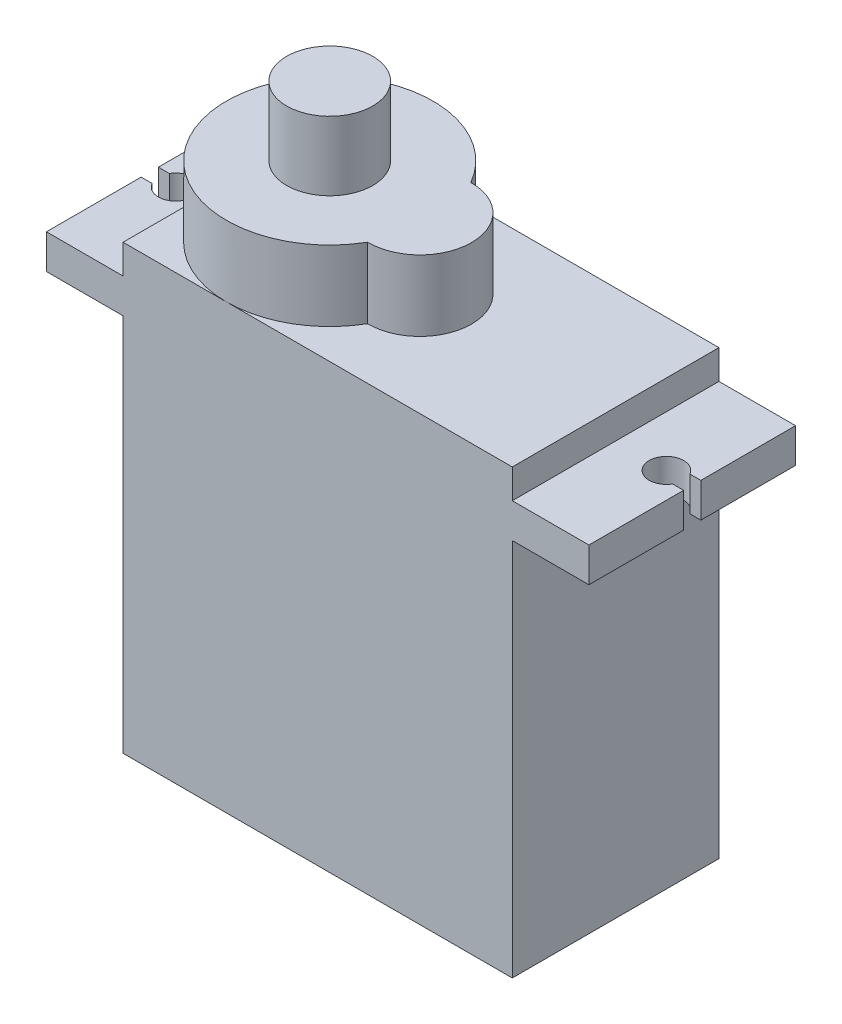
ISO-10303-21;
HEADER;
FILE_DESCRIPTION(('STEP AP214'),'2;1');
FILE_NAME('part.step','',(''),(''),'','','');
FILE_SCHEMA(('AUTOMOTIVE_DESIGN { 1 0 10303 214 1 1 1 1 }'));
ENDSEC;
DATA;
#1=APPLICATION_CONTEXT('core data for automotive mechanical design processes');
#2=APPLICATION_PROTOCOL_DEFINITION('international standard','automotive_design',2000,#1);
#3=PRODUCT_CONTEXT('',#1,'mechanical');
#4=PRODUCT('Part','Part','',(#3));
#5=PRODUCT_RELATED_PRODUCT_CATEGORY('part','',(#4));
#6=PRODUCT_DEFINITION_FORMATION('','',#4);
#7=PRODUCT_DEFINITION_CONTEXT('part definition',#1,'design');
#8=PRODUCT_DEFINITION('design','',#6,#7);
#9=PRODUCT_DEFINITION_SHAPE('','',#8);
#10=(LENGTH_UNIT() NAMED_UNIT(*) SI_UNIT(.MILLI.,.METRE.));
#11=(NAMED_UNIT(*) PLANE_ANGLE_UNIT() SI_UNIT($,.RADIAN.));
#12=(NAMED_UNIT(*) SI_UNIT($,.STERADIAN.) SOLID_ANGLE_UNIT());
#13=UNCERTAINTY_MEASURE_WITH_UNIT(LENGTH_MEASURE(1.E-05),#10,'distance_accuracy_value','');
#14=(GEOMETRIC_REPRESENTATION_CONTEXT(3) GLOBAL_UNCERTAINTY_ASSIGNED_CONTEXT((#13)) GLOBAL_UNIT_ASSIGNED_CONTEXT((#10,
#11,#12)) REPRESENTATION_CONTEXT('',''));
#15=CARTESIAN_POINT('',(0.,0.,0.));
#16=DIRECTION('',(0.,0.,1.));
#17=DIRECTION('',(1.,0.,0.));
#18=AXIS2_PLACEMENT_3D('',#15,#16,#17);
#19=CARTESIAN_POINT('',(0.,24.,0.));
#20=DIRECTION('',(0.,1.,0.));
#21=DIRECTION('',(0.,0.,1.));
#22=AXIS2_PLACEMENT_3D('',#19,#20,#21);
#23=PLANE('',#22);
#24=CARTESIAN_POINT('',(-2.95,24.,-6.));
#25=DIRECTION('',(0.,1.,0.));
#26=DIRECTION('',(0.,0.,1.));
#27=AXIS2_PLACEMENT_3D('',#24,#25,#26);
#28=CIRCLE('',#27,1.);
#29=CARTESIAN_POINT('',(-3.81602540378444,24.,-5.5));
#30=VERTEX_POINT('',#29);
#31=CARTESIAN_POINT('',(-3.81602540378444,24.,-6.5));
#32=VERTEX_POINT('',#31);
#33=EDGE_CURVE('E225',#30,#32,#28,.T.);
#34=ORIENTED_EDGE('',*,*,#33,.F.);
#35=DIRECTION('',(-1.,0.,0.));
#36=VECTOR('',#35,1.);
#37=CARTESIAN_POINT('',(0.,24.,-5.5));
#38=LINE('',#37,#36);
#39=CARTESIAN_POINT('',(-4.45,24.,-5.5));
#40=VERTEX_POINT('',#39);
#41=EDGE_CURVE('E204',#30,#40,#38,.T.);
#42=ORIENTED_EDGE('',*,*,#41,.T.);
#43=DIRECTION('',(0.,0.,1.));
#44=VECTOR('',#43,1.);
#45=CARTESIAN_POINT('',(-4.45,24.,-12.));
#46=LINE('',#45,#44);
#47=CARTESIAN_POINT('',(-4.45,24.,0.));
#48=VERTEX_POINT('',#47);
#49=EDGE_CURVE('E313',#40,#48,#46,.T.);
#50=ORIENTED_EDGE('',*,*,#49,.T.);
#51=DIRECTION('',(1.,0.,0.));
#52=VECTOR('',#51,1.);
#53=CARTESIAN_POINT('',(-4.45,24.,0.));
#54=LINE('',#53,#52);
#55=CARTESIAN_POINT('',(0.,24.,0.));
#56=VERTEX_POINT('',#55);
#57=EDGE_CURVE('E319',#48,#56,#54,.T.);
#58=ORIENTED_EDGE('',*,*,#57,.T.);
#59=DIRECTION('',(0.,0.,1.));
#60=VECTOR('',#59,1.);
#61=CARTESIAN_POINT('',(0.,24.,0.));
#62=LINE('',#61,#60);
#63=CARTESIAN_POINT('',(0.,24.,-12.));
#64=VERTEX_POINT('',#63);
#65=EDGE_CURVE('E278',#64,#56,#62,.T.);
#66=ORIENTED_EDGE('',*,*,#65,.F.);
#67=DIRECTION('',(-1.,0.,0.));
#68=VECTOR('',#67,1.);
#69=CARTESIAN_POINT('',(27.05,24.,-12.));
#70=LINE('',#69,#68);
#71=CARTESIAN_POINT('',(-4.45,24.,-12.));
#72=VERTEX_POINT('',#71);
#73=EDGE_CURVE('E314',#64,#72,#70,.T.);
#74=ORIENTED_EDGE('',*,*,#73,.T.);
#75=CARTESIAN_POINT('',(-4.45,24.,-6.5));
#76=VERTEX_POINT('',#75);
#77=EDGE_CURVE('E315',#72,#76,#46,.T.);
#78=ORIENTED_EDGE('',*,*,#77,.T.);
#79=DIRECTION('',(1.,0.,0.));
#80=VECTOR('',#79,1.);
#81=CARTESIAN_POINT('',(0.,24.,-6.5));
#82=LINE('',#81,#80);
#83=EDGE_CURVE('E55',#76,#32,#82,.T.);
#84=ORIENTED_EDGE('',*,*,#83,.T.);
#85=EDGE_LOOP('',(#34,#42,#50,#58,#66,#74,#78,#84));
#86=FACE_BOUND('',#85,.T.);
#87=ADVANCED_FACE('F38',(#86),#23,.T.);
#88=CARTESIAN_POINT('',(0.,22.,0.));
#89=DIRECTION('',(0.,1.,0.));
#90=DIRECTION('',(0.,0.,1.));
#91=AXIS2_PLACEMENT_3D('',#88,#89,#90);
#92=PLANE('',#91);
#93=DIRECTION('',(1.,0.,0.));
#94=VECTOR('',#93,1.);
#95=CARTESIAN_POINT('',(0.,22.,-5.5));
#96=LINE('',#95,#94);
#97=CARTESIAN_POINT('',(-4.45,22.,-5.5));
#98=VERTEX_POINT('',#97);
#99=CARTESIAN_POINT('',(-3.81602540378444,22.,-5.5));
#100=VERTEX_POINT('',#99);
#101=EDGE_CURVE('E201',#98,#100,#96,.T.);
#102=ORIENTED_EDGE('',*,*,#101,.T.);
#103=CARTESIAN_POINT('',(-2.95,22.,-6.));
#104=DIRECTION('',(0.,1.,0.));
#105=DIRECTION('',(0.,0.,1.));
#106=AXIS2_PLACEMENT_3D('',#103,#104,#105);
#107=CIRCLE('',#106,1.);
#108=CARTESIAN_POINT('',(-3.81602540378444,22.,-6.5));
#109=VERTEX_POINT('',#108);
#110=EDGE_CURVE('E211',#109,#100,#107,.F.);
#111=ORIENTED_EDGE('',*,*,#110,.F.);
#112=DIRECTION('',(-1.,0.,0.));
#113=VECTOR('',#112,1.);
#114=CARTESIAN_POINT('',(0.,22.,-6.5));
#115=LINE('',#114,#113);
#116=CARTESIAN_POINT('',(-4.45,22.,-6.5));
#117=VERTEX_POINT('',#116);
#118=EDGE_CURVE('E223',#109,#117,#115,.T.);
#119=ORIENTED_EDGE('',*,*,#118,.T.);
#120=DIRECTION('',(0.,0.,1.));
#121=VECTOR('',#120,1.);
#122=CARTESIAN_POINT('',(-4.45,22.,-12.));
#123=LINE('',#122,#121);
#124=CARTESIAN_POINT('',(-4.45,22.,-12.));
#125=VERTEX_POINT('',#124);
#126=EDGE_CURVE('E329',#125,#117,#123,.T.);
#127=ORIENTED_EDGE('',*,*,#126,.F.);
#128=DIRECTION('',(-1.,0.,0.));
#129=VECTOR('',#128,1.);
#130=CARTESIAN_POINT('',(27.05,22.,-12.));
#131=LINE('',#130,#129);
#132=CARTESIAN_POINT('',(0.,22.,-12.));
#133=VERTEX_POINT('',#132);
#134=EDGE_CURVE('E310',#133,#125,#131,.T.);
#135=ORIENTED_EDGE('',*,*,#134,.F.);
#136=DIRECTION('',(0.,0.,1.));
#137=VECTOR('',#136,1.);
#138=CARTESIAN_POINT('',(0.,22.,0.));
#139=LINE('',#138,#137);
#140=CARTESIAN_POINT('',(0.,22.,0.));
#141=VERTEX_POINT('',#140);
#142=EDGE_CURVE('E352',#133,#141,#139,.T.);
#143=ORIENTED_EDGE('',*,*,#142,.T.);
#144=DIRECTION('',(1.,0.,0.));
#145=VECTOR('',#144,1.);
#146=CARTESIAN_POINT('',(-4.45,22.,0.));
#147=LINE('',#146,#145);
#148=CARTESIAN_POINT('',(-4.45,22.,0.));
#149=VERTEX_POINT('',#148);
#150=EDGE_CURVE('E333',#149,#141,#147,.T.);
#151=ORIENTED_EDGE('',*,*,#150,.F.);
#152=EDGE_CURVE('E222',#98,#149,#123,.T.);
#153=ORIENTED_EDGE('',*,*,#152,.F.);
#154=EDGE_LOOP('',(#102,#111,#119,#127,#135,#143,#151,#153));
#155=FACE_BOUND('',#154,.T.);
#156=ADVANCED_FACE('F220',(#155),#92,.F.);
#157=CARTESIAN_POINT('',(-4.45,24.,-12.));
#158=DIRECTION('',(1.,0.,0.));
#159=DIRECTION('',(0.,0.,-1.));
#160=AXIS2_PLACEMENT_3D('',#157,#158,#159);
#161=PLANE('',#160);
#162=DIRECTION('',(0.,1.,0.));
#163=VECTOR('',#162,1.);
#164=CARTESIAN_POINT('',(-4.45,-0.001000000000001,-5.5));
#165=LINE('',#164,#163);
#166=EDGE_CURVE('E217',#98,#40,#165,.T.);
#167=ORIENTED_EDGE('',*,*,#166,.F.);
#168=ORIENTED_EDGE('',*,*,#152,.T.);
#169=DIRECTION('',(0.,-1.,0.));
#170=VECTOR('',#169,1.);
#171=CARTESIAN_POINT('',(-4.45,24.,0.));
#172=LINE('',#171,#170);
#173=EDGE_CURVE('E345',#48,#149,#172,.T.);
#174=ORIENTED_EDGE('',*,*,#173,.F.);
#175=ORIENTED_EDGE('',*,*,#49,.F.);
#176=EDGE_LOOP('',(#167,#168,#174,#175));
#177=FACE_BOUND('',#176,.T.);
#178=ADVANCED_FACE('F468',(#177),#161,.F.);
#179=DIRECTION('',(0.,1.,0.));
#180=VECTOR('',#179,1.);
#181=CARTESIAN_POINT('',(-4.45,-0.001000000000001,-6.5));
#182=LINE('',#181,#180);
#183=EDGE_CURVE('E233',#117,#76,#182,.T.);
#184=ORIENTED_EDGE('',*,*,#183,.T.);
#185=ORIENTED_EDGE('',*,*,#77,.F.);
#186=DIRECTION('',(0.,-1.,0.));
#187=VECTOR('',#186,1.);
#188=CARTESIAN_POINT('',(-4.45,24.,-12.));
#189=LINE('',#188,#187);
#190=EDGE_CURVE('E348',#72,#125,#189,.T.);
#191=ORIENTED_EDGE('',*,*,#190,.T.);
#192=ORIENTED_EDGE('',*,*,#126,.T.);
#193=EDGE_LOOP('',(#184,#185,#191,#192));
#194=FACE_BOUND('',#193,.T.);
#195=ADVANCED_FACE('F430',(#194),#161,.F.);
#196=CARTESIAN_POINT('',(27.05,24.,0.));
#197=DIRECTION('',(-1.,0.,0.));
#198=DIRECTION('',(0.,0.,1.));
#199=AXIS2_PLACEMENT_3D('',#196,#197,#198);
#200=PLANE('',#199);
#201=DIRECTION('',(0.,0.,-1.));
#202=VECTOR('',#201,1.);
#203=CARTESIAN_POINT('',(27.05,24.,0.));
#204=LINE('',#203,#202);
#205=CARTESIAN_POINT('',(27.05,24.,-6.5));
#206=VERTEX_POINT('',#205);
#207=CARTESIAN_POINT('',(27.05,24.,-12.));
#208=VERTEX_POINT('',#207);
#209=EDGE_CURVE('E321',#206,#208,#204,.T.);
#210=ORIENTED_EDGE('',*,*,#209,.F.);
#211=DIRECTION('',(0.,1.,0.));
#212=VECTOR('',#211,1.);
#213=CARTESIAN_POINT('',(27.05,-0.001000000000001,-6.5));
#214=LINE('',#213,#212);
#215=CARTESIAN_POINT('',(27.05,22.,-6.5));
#216=VERTEX_POINT('',#215);
#217=EDGE_CURVE('E250',#216,#206,#214,.T.);
#218=ORIENTED_EDGE('',*,*,#217,.F.);
#219=DIRECTION('',(0.,0.,-1.));
#220=VECTOR('',#219,1.);
#221=CARTESIAN_POINT('',(27.05,22.,0.));
#222=LINE('',#221,#220);
#223=CARTESIAN_POINT('',(27.05,22.,-12.));
#224=VERTEX_POINT('',#223);
#225=EDGE_CURVE('E336',#216,#224,#222,.T.);
#226=ORIENTED_EDGE('',*,*,#225,.T.);
#227=DIRECTION('',(0.,-1.,0.));
#228=VECTOR('',#227,1.);
#229=CARTESIAN_POINT('',(27.05,24.,-12.));
#230=LINE('',#229,#228);
#231=EDGE_CURVE('E325',#208,#224,#230,.T.);
#232=ORIENTED_EDGE('',*,*,#231,.F.);
#233=EDGE_LOOP('',(#210,#218,#226,#232));
#234=FACE_BOUND('',#233,.T.);
#235=ADVANCED_FACE('F412',(#234),#200,.F.);
#236=CARTESIAN_POINT('',(0.,25.7,0.));
#237=DIRECTION('',(0.,-1.,0.));
#238=DIRECTION('',(0.,0.,-1.));
#239=AXIS2_PLACEMENT_3D('',#236,#237,#238);
#240=PLANE('',#239);
#241=CARTESIAN_POINT('',(6.,25.7,-6.));
#242=DIRECTION('',(0.,1.,0.));
#243=DIRECTION('',(0.,0.,1.));
#244=AXIS2_PLACEMENT_3D('',#241,#242,#243);
#245=CIRCLE('',#244,6.);
#246=CARTESIAN_POINT('',(11.1963070609208,25.7,-8.99973214281289));
#247=VERTEX_POINT('',#246);
#248=CARTESIAN_POINT('',(6.,25.7,-12.));
#249=VERTEX_POINT('',#248);
#250=EDGE_CURVE('E259',#247,#249,#245,.T.);
#251=ORIENTED_EDGE('',*,*,#250,.F.);
#252=CARTESIAN_POINT('',(11.236395355661,25.7,-6.));
#253=DIRECTION('',(0.,1.,0.));
#254=DIRECTION('',(0.,0.,1.));
#255=AXIS2_PLACEMENT_3D('',#252,#253,#254);
#256=CIRCLE('',#255,3.);
#257=CARTESIAN_POINT('',(11.1963070609208,25.7,-3.00026785718711));
#258=VERTEX_POINT('',#257);
#259=EDGE_CURVE('E265',#258,#247,#256,.T.);
#260=ORIENTED_EDGE('',*,*,#259,.F.);
#261=CARTESIAN_POINT('',(6.,25.7,0.));
#262=VERTEX_POINT('',#261);
#263=EDGE_CURVE('E270',#262,#258,#245,.T.);
#264=ORIENTED_EDGE('',*,*,#263,.F.);
#265=DIRECTION('',(1.,0.,0.));
#266=VECTOR('',#265,1.);
#267=CARTESIAN_POINT('',(0.,25.7,0.));
#268=LINE('',#267,#266);
#269=CARTESIAN_POINT('',(22.6,25.7,0.));
#270=VERTEX_POINT('',#269);
#271=EDGE_CURVE('E282',#262,#270,#268,.T.);
#272=ORIENTED_EDGE('',*,*,#271,.T.);
#273=DIRECTION('',(0.,0.,-1.));
#274=VECTOR('',#273,1.);
#275=CARTESIAN_POINT('',(22.6,25.7,0.));
#276=LINE('',#275,#274);
#277=CARTESIAN_POINT('',(22.6,25.7,-12.));
#278=VERTEX_POINT('',#277);
#279=EDGE_CURVE('E287',#270,#278,#276,.T.);
#280=ORIENTED_EDGE('',*,*,#279,.T.);
#281=DIRECTION('',(-1.,0.,0.));
#282=VECTOR('',#281,1.);
#283=CARTESIAN_POINT('',(0.,25.7,-12.));
#284=LINE('',#283,#282);
#285=EDGE_CURVE('E290',#278,#249,#284,.T.);
#286=ORIENTED_EDGE('',*,*,#285,.T.);
#287=EDGE_LOOP('',(#251,#260,#264,#272,#280,#286));
#288=FACE_BOUND('',#287,.T.);
#289=ADVANCED_FACE('F395',(#288),#240,.F.);
#290=CARTESIAN_POINT('',(0.,25.7,-6.));
#291=VERTEX_POINT('',#290);
#292=EDGE_CURVE('E47',#249,#291,#245,.T.);
#293=ORIENTED_EDGE('',*,*,#292,.F.);
#294=CARTESIAN_POINT('',(0.,25.7,-12.));
#295=VERTEX_POINT('',#294);
#296=EDGE_CURVE('E289',#249,#295,#284,.T.);
#297=ORIENTED_EDGE('',*,*,#296,.T.);
#298=DIRECTION('',(0.,0.,1.));
#299=VECTOR('',#298,1.);
#300=CARTESIAN_POINT('',(0.,25.7,0.));
#301=LINE('',#300,#299);
#302=EDGE_CURVE('E279',#295,#291,#301,.T.);
#303=ORIENTED_EDGE('',*,*,#302,.T.);
#304=EDGE_LOOP('',(#293,#297,#303));
#305=FACE_BOUND('',#304,.T.);
#306=ADVANCED_FACE('F387',(#305),#240,.F.);
#307=CARTESIAN_POINT('',(0.,22.,0.));
#308=DIRECTION('',(1.,0.,0.));
#309=DIRECTION('',(0.,0.,-1.));
#310=AXIS2_PLACEMENT_3D('',#307,#308,#309);
#311=PLANE('',#310);
#312=DIRECTION('',(0.,0.,1.));
#313=VECTOR('',#312,1.);
#314=CARTESIAN_POINT('',(0.,0.,0.));
#315=LINE('',#314,#313);
#316=CARTESIAN_POINT('',(0.,0.,-12.));
#317=VERTEX_POINT('',#316);
#318=CARTESIAN_POINT('',(0.,0.,0.));
#319=VERTEX_POINT('',#318);
#320=EDGE_CURVE('E351',#317,#319,#315,.T.);
#321=ORIENTED_EDGE('',*,*,#320,.T.);
#322=DIRECTION('',(0.,-1.,0.));
#323=VECTOR('',#322,1.);
#324=CARTESIAN_POINT('',(0.,22.,0.));
#325=LINE('',#324,#323);
#326=EDGE_CURVE('E42',#141,#319,#325,.T.);
#327=ORIENTED_EDGE('',*,*,#326,.F.);
#328=ORIENTED_EDGE('',*,*,#142,.F.);
#329=DIRECTION('',(0.,-1.,0.));
#330=VECTOR('',#329,1.);
#331=CARTESIAN_POINT('',(0.,22.,-12.));
#332=LINE('',#331,#330);
#333=EDGE_CURVE('E359',#133,#317,#332,.T.);
#334=ORIENTED_EDGE('',*,*,#333,.T.);
#335=EDGE_LOOP('',(#321,#327,#328,#334));
#336=FACE_BOUND('',#335,.T.);
#337=ADVANCED_FACE('F40',(#336),#311,.F.);
#338=CARTESIAN_POINT('',(0.,22.,0.));
#339=DIRECTION('',(0.,0.,-1.));
#340=DIRECTION('',(-1.,0.,0.));
#341=AXIS2_PLACEMENT_3D('',#338,#339,#340);
#342=PLANE('',#341);
#343=DIRECTION('',(1.,0.,0.));
#344=VECTOR('',#343,1.);
#345=CARTESIAN_POINT('',(0.,0.,0.));
#346=LINE('',#345,#344);
#347=CARTESIAN_POINT('',(22.6,0.,0.));
#348=VERTEX_POINT('',#347);
#349=EDGE_CURVE('E362',#319,#348,#346,.T.);
#350=ORIENTED_EDGE('',*,*,#349,.T.);
#351=DIRECTION('',(0.,-1.,0.));
#352=VECTOR('',#351,1.);
#353=CARTESIAN_POINT('',(22.6,22.,0.));
#354=LINE('',#353,#352);
#355=CARTESIAN_POINT('',(22.6,22.,0.));
#356=VERTEX_POINT('',#355);
#357=EDGE_CURVE('E371',#356,#348,#354,.T.);
#358=ORIENTED_EDGE('',*,*,#357,.F.);
#359=CARTESIAN_POINT('',(27.05,22.,0.));
#360=VERTEX_POINT('',#359);
#361=EDGE_CURVE('E332',#356,#360,#147,.T.);
#362=ORIENTED_EDGE('',*,*,#361,.T.);
#363=DIRECTION('',(0.,-1.,0.));
#364=VECTOR('',#363,1.);
#365=CARTESIAN_POINT('',(27.05,24.,0.));
#366=LINE('',#365,#364);
#367=CARTESIAN_POINT('',(27.05,24.,0.));
#368=VERTEX_POINT('',#367);
#369=EDGE_CURVE('E342',#368,#360,#366,.T.);
#370=ORIENTED_EDGE('',*,*,#369,.F.);
#371=CARTESIAN_POINT('',(22.6,24.,0.));
#372=VERTEX_POINT('',#371);
#373=EDGE_CURVE('E318',#372,#368,#54,.T.);
#374=ORIENTED_EDGE('',*,*,#373,.F.);
#375=DIRECTION('',(0.,-1.,0.));
#376=VECTOR('',#375,1.);
#377=CARTESIAN_POINT('',(22.6,25.7,0.));
#378=LINE('',#377,#376);
#379=EDGE_CURVE('E304',#270,#372,#378,.T.);
#380=ORIENTED_EDGE('',*,*,#379,.F.);
#381=ORIENTED_EDGE('',*,*,#271,.F.);
#382=CARTESIAN_POINT('',(0.,25.7,0.));
#383=VERTEX_POINT('',#382);
#384=EDGE_CURVE('E284',#383,#262,#268,.T.);
#385=ORIENTED_EDGE('',*,*,#384,.F.);
#386=DIRECTION('',(0.,-1.,0.));
#387=VECTOR('',#386,1.);
#388=CARTESIAN_POINT('',(0.,25.7,0.));
#389=LINE('',#388,#387);
#390=EDGE_CURVE('E307',#383,#56,#389,.T.);
#391=ORIENTED_EDGE('',*,*,#390,.T.);
#392=ORIENTED_EDGE('',*,*,#57,.F.);
#393=ORIENTED_EDGE('',*,*,#173,.T.);
#394=ORIENTED_EDGE('',*,*,#150,.T.);
#395=ORIENTED_EDGE('',*,*,#326,.T.);
#396=EDGE_LOOP('',(#350,#358,#362,#370,#374,#380,#381,#385,#391,#392,#393,#394,#395));
#397=FACE_BOUND('',#396,.T.);
#398=ADVANCED_FACE('F439',(#397),#342,.F.);
#399=CARTESIAN_POINT('',(22.6,22.,0.));
#400=DIRECTION('',(-1.,0.,0.));
#401=DIRECTION('',(0.,0.,1.));
#402=AXIS2_PLACEMENT_3D('',#399,#400,#401);
#403=PLANE('',#402);
#404=DIRECTION('',(0.,0.,-1.));
#405=VECTOR('',#404,1.);
#406=CARTESIAN_POINT('',(22.6,0.,0.));
#407=LINE('',#406,#405);
#408=CARTESIAN_POINT('',(22.6,0.,-12.));
#409=VERTEX_POINT('',#408);
#410=EDGE_CURVE('E364',#348,#409,#407,.T.);
#411=ORIENTED_EDGE('',*,*,#410,.T.);
#412=DIRECTION('',(0.,-1.,0.));
#413=VECTOR('',#412,1.);
#414=CARTESIAN_POINT('',(22.6,22.,-12.));
#415=LINE('',#414,#413);
#416=CARTESIAN_POINT('',(22.6,22.,-12.));
#417=VERTEX_POINT('',#416);
#418=EDGE_CURVE('E369',#417,#409,#415,.T.);
#419=ORIENTED_EDGE('',*,*,#418,.F.);
#420=DIRECTION('',(0.,0.,-1.));
#421=VECTOR('',#420,1.);
#422=CARTESIAN_POINT('',(22.6,22.,0.));
#423=LINE('',#422,#421);
#424=EDGE_CURVE('E355',#356,#417,#423,.T.);
#425=ORIENTED_EDGE('',*,*,#424,.F.);
#426=ORIENTED_EDGE('',*,*,#357,.T.);
#427=EDGE_LOOP('',(#411,#419,#425,#426));
#428=FACE_BOUND('',#427,.T.);
#429=ADVANCED_FACE('F496',(#428),#403,.F.);
#430=CARTESIAN_POINT('',(0.,22.,-12.));
#431=DIRECTION('',(0.,0.,1.));
#432=DIRECTION('',(1.,0.,0.));
#433=AXIS2_PLACEMENT_3D('',#430,#431,#432);
#434=PLANE('',#433);
#435=DIRECTION('',(-1.,0.,0.));
#436=VECTOR('',#435,1.);
#437=CARTESIAN_POINT('',(0.,0.,-12.));
#438=LINE('',#437,#436);
#439=EDGE_CURVE('E356',#409,#317,#438,.T.);
#440=ORIENTED_EDGE('',*,*,#439,.T.);
#441=ORIENTED_EDGE('',*,*,#333,.F.);
#442=ORIENTED_EDGE('',*,*,#134,.T.);
#443=ORIENTED_EDGE('',*,*,#190,.F.);
#444=ORIENTED_EDGE('',*,*,#73,.F.);
#445=DIRECTION('',(0.,-1.,0.));
#446=VECTOR('',#445,1.);
#447=CARTESIAN_POINT('',(0.,25.7,-12.));
#448=LINE('',#447,#446);
#449=EDGE_CURVE('E293',#295,#64,#448,.T.);
#450=ORIENTED_EDGE('',*,*,#449,.F.);
#451=ORIENTED_EDGE('',*,*,#296,.F.);
#452=ORIENTED_EDGE('',*,*,#285,.F.);
#453=DIRECTION('',(0.,-1.,0.));
#454=VECTOR('',#453,1.);
#455=CARTESIAN_POINT('',(22.6,25.7,-12.));
#456=LINE('',#455,#454);
#457=CARTESIAN_POINT('',(22.6,24.,-12.));
#458=VERTEX_POINT('',#457);
#459=EDGE_CURVE('E301',#278,#458,#456,.T.);
#460=ORIENTED_EDGE('',*,*,#459,.T.);
#461=EDGE_CURVE('E311',#208,#458,#70,.T.);
#462=ORIENTED_EDGE('',*,*,#461,.F.);
#463=ORIENTED_EDGE('',*,*,#231,.T.);
#464=EDGE_CURVE('E326',#224,#417,#131,.T.);
#465=ORIENTED_EDGE('',*,*,#464,.T.);
#466=ORIENTED_EDGE('',*,*,#418,.T.);
#467=EDGE_LOOP('',(#440,#441,#442,#443,#444,#450,#451,#452,#460,#462,#463,#465,#466));
#468=FACE_BOUND('',#467,.T.);
#469=ADVANCED_FACE('F392',(#468),#434,.F.);
#470=CARTESIAN_POINT('',(0.,0.,0.));
#471=DIRECTION('',(0.,-1.,0.));
#472=DIRECTION('',(0.,0.,-1.));
#473=AXIS2_PLACEMENT_3D('',#470,#471,#472);
#474=PLANE('',#473);
#475=ORIENTED_EDGE('',*,*,#320,.F.);
#476=ORIENTED_EDGE('',*,*,#439,.F.);
#477=ORIENTED_EDGE('',*,*,#410,.F.);
#478=ORIENTED_EDGE('',*,*,#349,.F.);
#479=EDGE_LOOP('',(#475,#476,#477,#478));
#480=FACE_BOUND('',#479,.T.);
#481=ADVANCED_FACE('F422',(#480),#474,.T.);
#482=ORIENTED_EDGE('',*,*,#225,.F.);
#483=DIRECTION('',(1.,0.,0.));
#484=VECTOR('',#483,1.);
#485=CARTESIAN_POINT('',(0.,22.,-6.49999999999999));
#486=LINE('',#485,#484);
#487=CARTESIAN_POINT('',(26.4160254037844,22.,-6.5));
#488=VERTEX_POINT('',#487);
#489=EDGE_CURVE('E239',#488,#216,#486,.T.);
#490=ORIENTED_EDGE('',*,*,#489,.F.);
#491=CARTESIAN_POINT('',(25.55,22.,-6.));
#492=DIRECTION('',(0.,1.,0.));
#493=DIRECTION('',(0.,0.,1.));
#494=AXIS2_PLACEMENT_3D('',#491,#492,#493);
#495=CIRCLE('',#494,1.);
#496=CARTESIAN_POINT('',(26.4160254037844,22.,-5.5));
#497=VERTEX_POINT('',#496);
#498=EDGE_CURVE('E236',#497,#488,#495,.F.);
#499=ORIENTED_EDGE('',*,*,#498,.F.);
#500=DIRECTION('',(-1.,0.,0.));
#501=VECTOR('',#500,1.);
#502=CARTESIAN_POINT('',(0.,22.,-5.5));
#503=LINE('',#502,#501);
#504=CARTESIAN_POINT('',(27.05,22.,-5.5));
#505=VERTEX_POINT('',#504);
#506=EDGE_CURVE('E227',#505,#497,#503,.T.);
#507=ORIENTED_EDGE('',*,*,#506,.F.);
#508=EDGE_CURVE('E337',#360,#505,#222,.T.);
#509=ORIENTED_EDGE('',*,*,#508,.F.);
#510=ORIENTED_EDGE('',*,*,#361,.F.);
#511=ORIENTED_EDGE('',*,*,#424,.T.);
#512=ORIENTED_EDGE('',*,*,#464,.F.);
#513=EDGE_LOOP('',(#482,#490,#499,#507,#509,#510,#511,#512));
#514=FACE_BOUND('',#513,.T.);
#515=ADVANCED_FACE('F416',(#514),#92,.F.);
#516=ORIENTED_EDGE('',*,*,#508,.T.);
#517=DIRECTION('',(0.,1.,0.));
#518=VECTOR('',#517,1.);
#519=CARTESIAN_POINT('',(27.05,-0.001000000000001,-5.5));
#520=LINE('',#519,#518);
#521=CARTESIAN_POINT('',(27.05,24.,-5.5));
#522=VERTEX_POINT('',#521);
#523=EDGE_CURVE('E252',#505,#522,#520,.T.);
#524=ORIENTED_EDGE('',*,*,#523,.T.);
#525=EDGE_CURVE('E322',#368,#522,#204,.T.);
#526=ORIENTED_EDGE('',*,*,#525,.F.);
#527=ORIENTED_EDGE('',*,*,#369,.T.);
#528=EDGE_LOOP('',(#516,#524,#526,#527));
#529=FACE_BOUND('',#528,.T.);
#530=ADVANCED_FACE('F445',(#529),#200,.F.);
#531=DIRECTION('',(-1.,0.,0.));
#532=VECTOR('',#531,1.);
#533=CARTESIAN_POINT('',(0.,24.,-6.49999999999999));
#534=LINE('',#533,#532);
#535=CARTESIAN_POINT('',(26.4160254037844,24.,-6.5));
#536=VERTEX_POINT('',#535);
#537=EDGE_CURVE('E244',#206,#536,#534,.T.);
#538=ORIENTED_EDGE('',*,*,#537,.F.);
#539=ORIENTED_EDGE('',*,*,#209,.T.);
#540=ORIENTED_EDGE('',*,*,#461,.T.);
#541=DIRECTION('',(0.,0.,-1.));
#542=VECTOR('',#541,1.);
#543=CARTESIAN_POINT('',(22.6,24.,0.));
#544=LINE('',#543,#542);
#545=EDGE_CURVE('E296',#372,#458,#544,.T.);
#546=ORIENTED_EDGE('',*,*,#545,.F.);
#547=ORIENTED_EDGE('',*,*,#373,.T.);
#548=ORIENTED_EDGE('',*,*,#525,.T.);
#549=DIRECTION('',(1.,0.,0.));
#550=VECTOR('',#549,1.);
#551=CARTESIAN_POINT('',(0.,24.,-5.5));
#552=LINE('',#551,#550);
#553=CARTESIAN_POINT('',(26.4160254037844,24.,-5.5));
#554=VERTEX_POINT('',#553);
#555=EDGE_CURVE('E242',#554,#522,#552,.T.);
#556=ORIENTED_EDGE('',*,*,#555,.F.);
#557=CARTESIAN_POINT('',(25.55,24.,-6.));
#558=DIRECTION('',(0.,1.,0.));
#559=DIRECTION('',(0.,0.,1.));
#560=AXIS2_PLACEMENT_3D('',#557,#558,#559);
#561=CIRCLE('',#560,1.);
#562=EDGE_CURVE('E63',#536,#554,#561,.T.);
#563=ORIENTED_EDGE('',*,*,#562,.F.);
#564=EDGE_LOOP('',(#538,#539,#540,#546,#547,#548,#556,#563));
#565=FACE_BOUND('',#564,.T.);
#566=ADVANCED_FACE('F407',(#565),#23,.T.);
#567=CARTESIAN_POINT('',(0.,25.7,0.));
#568=DIRECTION('',(1.,0.,0.));
#569=DIRECTION('',(0.,0.,-1.));
#570=AXIS2_PLACEMENT_3D('',#567,#568,#569);
#571=PLANE('',#570);
#572=ORIENTED_EDGE('',*,*,#65,.T.);
#573=ORIENTED_EDGE('',*,*,#390,.F.);
#574=EDGE_CURVE('E283',#291,#383,#301,.T.);
#575=ORIENTED_EDGE('',*,*,#574,.F.);
#576=ORIENTED_EDGE('',*,*,#302,.F.);
#577=ORIENTED_EDGE('',*,*,#449,.T.);
#578=EDGE_LOOP('',(#572,#573,#575,#576,#577));
#579=FACE_BOUND('',#578,.T.);
#580=ADVANCED_FACE('F433',(#579),#571,.F.);
#581=CARTESIAN_POINT('',(22.6,25.7,0.));
#582=DIRECTION('',(-1.,0.,0.));
#583=DIRECTION('',(0.,0.,1.));
#584=AXIS2_PLACEMENT_3D('',#581,#582,#583);
#585=PLANE('',#584);
#586=ORIENTED_EDGE('',*,*,#545,.T.);
#587=ORIENTED_EDGE('',*,*,#459,.F.);
#588=ORIENTED_EDGE('',*,*,#279,.F.);
#589=ORIENTED_EDGE('',*,*,#379,.T.);
#590=EDGE_LOOP('',(#586,#587,#588,#589));
#591=FACE_BOUND('',#590,.T.);
#592=ADVANCED_FACE('F401',(#591),#585,.F.);
#593=EDGE_CURVE('E379',#291,#262,#245,.T.);
#594=ORIENTED_EDGE('',*,*,#593,.F.);
#595=ORIENTED_EDGE('',*,*,#574,.T.);
#596=ORIENTED_EDGE('',*,*,#384,.T.);
#597=EDGE_LOOP('',(#594,#595,#596));
#598=FACE_BOUND('',#597,.T.);
#599=ADVANCED_FACE('F438',(#598),#240,.F.);
#600=CARTESIAN_POINT('',(6.,29.8,-6.));
#601=DIRECTION('',(0.,-1.,0.));
#602=DIRECTION('',(0.,0.,-1.));
#603=AXIS2_PLACEMENT_3D('',#600,#601,#602);
#604=CYLINDRICAL_SURFACE('',#603,6.);
#605=ORIENTED_EDGE('',*,*,#250,.T.);
#606=ORIENTED_EDGE('',*,*,#292,.T.);
#607=ORIENTED_EDGE('',*,*,#593,.T.);
#608=ORIENTED_EDGE('',*,*,#263,.T.);
#609=DIRECTION('',(0.,-1.,0.));
#610=VECTOR('',#609,1.);
#611=CARTESIAN_POINT('',(11.1963070609208,29.8,-3.00026785718711));
#612=LINE('',#611,#610);
#613=CARTESIAN_POINT('',(11.1963070609208,29.8,-3.00026785718711));
#614=VERTEX_POINT('',#613);
#615=EDGE_CURVE('E275',#614,#258,#612,.T.);
#616=ORIENTED_EDGE('',*,*,#615,.F.);
#617=CARTESIAN_POINT('',(6.,29.8,-6.));
#618=DIRECTION('',(0.,1.,0.));
#619=DIRECTION('',(0.,0.,1.));
#620=AXIS2_PLACEMENT_3D('',#617,#618,#619);
#621=CIRCLE('',#620,6.);
#622=CARTESIAN_POINT('',(11.1963070609208,29.8,-8.99973214281289));
#623=VERTEX_POINT('',#622);
#624=EDGE_CURVE('E261',#623,#614,#621,.T.);
#625=ORIENTED_EDGE('',*,*,#624,.F.);
#626=DIRECTION('',(0.,-1.,0.));
#627=VECTOR('',#626,1.);
#628=CARTESIAN_POINT('',(11.1963070609208,29.8,-8.99973214281289));
#629=LINE('',#628,#627);
#630=EDGE_CURVE('E267',#623,#247,#629,.T.);
#631=ORIENTED_EDGE('',*,*,#630,.T.);
#632=EDGE_LOOP('',(#605,#606,#607,#608,#616,#625,#631));
#633=FACE_BOUND('',#632,.T.);
#634=ADVANCED_FACE('F384',(#633),#604,.T.);
#635=CARTESIAN_POINT('',(11.236395355661,29.8,-6.));
#636=DIRECTION('',(0.,-1.,0.));
#637=DIRECTION('',(0.,0.,-1.));
#638=AXIS2_PLACEMENT_3D('',#635,#636,#637);
#639=CYLINDRICAL_SURFACE('',#638,3.);
#640=ORIENTED_EDGE('',*,*,#259,.T.);
#641=ORIENTED_EDGE('',*,*,#630,.F.);
#642=CARTESIAN_POINT('',(11.236395355661,29.8,-6.));
#643=DIRECTION('',(0.,1.,0.));
#644=DIRECTION('',(0.,0.,1.));
#645=AXIS2_PLACEMENT_3D('',#642,#643,#644);
#646=CIRCLE('',#645,3.);
#647=EDGE_CURVE('E264',#614,#623,#646,.T.);
#648=ORIENTED_EDGE('',*,*,#647,.F.);
#649=ORIENTED_EDGE('',*,*,#615,.T.);
#650=EDGE_LOOP('',(#640,#641,#648,#649));
#651=FACE_BOUND('',#650,.T.);
#652=ADVANCED_FACE('F514',(#651),#639,.T.);
#653=CARTESIAN_POINT('',(0.,29.8,0.));
#654=DIRECTION('',(0.,1.,0.));
#655=DIRECTION('',(0.,0.,1.));
#656=AXIS2_PLACEMENT_3D('',#653,#654,#655);
#657=PLANE('',#656);
#658=CARTESIAN_POINT('',(6.,29.8,-6.));
#659=DIRECTION('',(0.,1.,0.));
#660=DIRECTION('',(0.,0.,1.));
#661=AXIS2_PLACEMENT_3D('',#658,#659,#660);
#662=CIRCLE('',#661,2.5);
#663=CARTESIAN_POINT('',(6.,29.8,-3.5));
#664=VERTEX_POINT('',#663);
#665=EDGE_CURVE('E11',#664,#664,#662,.T.);
#666=ORIENTED_EDGE('',*,*,#665,.F.);
#667=EDGE_LOOP('',(#666));
#668=FACE_BOUND('',#667,.T.);
#669=ORIENTED_EDGE('',*,*,#624,.T.);
#670=ORIENTED_EDGE('',*,*,#647,.T.);
#671=EDGE_LOOP('',(#669,#670));
#672=FACE_BOUND('',#671,.T.);
#673=ADVANCED_FACE('F547',(#668,#672),#657,.T.);
#674=CARTESIAN_POINT('',(6.,33.8,-6.));
#675=DIRECTION('',(0.,-1.,0.));
#676=DIRECTION('',(0.,0.,-1.));
#677=AXIS2_PLACEMENT_3D('',#674,#675,#676);
#678=CYLINDRICAL_SURFACE('',#677,2.5);
#679=CARTESIAN_POINT('',(6.,33.8,-6.));
#680=DIRECTION('',(0.,1.,0.));
#681=DIRECTION('',(0.,0.,1.));
#682=AXIS2_PLACEMENT_3D('',#679,#680,#681);
#683=CIRCLE('',#682,2.5);
#684=CARTESIAN_POINT('',(6.,33.8,-3.5));
#685=VERTEX_POINT('',#684);
#686=EDGE_CURVE('E216',#685,#685,#683,.T.);
#687=ORIENTED_EDGE('',*,*,#686,.F.);
#688=EDGE_LOOP('',(#687));
#689=FACE_BOUND('',#688,.T.);
#690=ORIENTED_EDGE('',*,*,#665,.T.);
#691=EDGE_LOOP('',(#690));
#692=FACE_BOUND('',#691,.T.);
#693=ADVANCED_FACE('F558',(#689,#692),#678,.T.);
#694=CARTESIAN_POINT('',(6.,33.8,-6.));
#695=DIRECTION('',(0.,1.,0.));
#696=DIRECTION('',(0.,0.,1.));
#697=AXIS2_PLACEMENT_3D('',#694,#695,#696);
#698=PLANE('',#697);
#699=ORIENTED_EDGE('',*,*,#686,.T.);
#700=EDGE_LOOP('',(#699));
#701=FACE_BOUND('',#700,.T.);
#702=ADVANCED_FACE('F460',(#701),#698,.T.);
#703=CARTESIAN_POINT('',(25.55,-0.001000000000001,-6.));
#704=DIRECTION('',(0.,1.,0.));
#705=DIRECTION('',(0.,0.,1.));
#706=AXIS2_PLACEMENT_3D('',#703,#704,#705);
#707=CYLINDRICAL_SURFACE('',#706,1.);
#708=ORIENTED_EDGE('',*,*,#498,.T.);
#709=DIRECTION('',(0.,1.,0.));
#710=VECTOR('',#709,1.);
#711=CARTESIAN_POINT('',(26.4160254037844,-0.001000000000001,-6.5));
#712=LINE('',#711,#710);
#713=EDGE_CURVE('E248',#488,#536,#712,.T.);
#714=ORIENTED_EDGE('',*,*,#713,.T.);
#715=ORIENTED_EDGE('',*,*,#562,.T.);
#716=DIRECTION('',(0.,1.,0.));
#717=VECTOR('',#716,1.);
#718=CARTESIAN_POINT('',(26.4160254037844,-0.001000000000001,-5.5));
#719=LINE('',#718,#717);
#720=EDGE_CURVE('E247',#497,#554,#719,.T.);
#721=ORIENTED_EDGE('',*,*,#720,.F.);
#722=EDGE_LOOP('',(#708,#714,#715,#721));
#723=FACE_BOUND('',#722,.T.);
#724=ADVANCED_FACE('F450',(#723),#707,.F.);
#725=CARTESIAN_POINT('',(0.,-0.001000000000001,-6.49999999999999));
#726=DIRECTION('',(0.,0.,-1.));
#727=DIRECTION('',(-1.,0.,0.));
#728=AXIS2_PLACEMENT_3D('',#725,#726,#727);
#729=PLANE('',#728);
#730=ORIENTED_EDGE('',*,*,#489,.T.);
#731=ORIENTED_EDGE('',*,*,#217,.T.);
#732=ORIENTED_EDGE('',*,*,#537,.T.);
#733=ORIENTED_EDGE('',*,*,#713,.F.);
#734=EDGE_LOOP('',(#730,#731,#732,#733));
#735=FACE_BOUND('',#734,.T.);
#736=ADVANCED_FACE('F452',(#735),#729,.F.);
#737=CARTESIAN_POINT('',(0.,-0.001000000000001,-5.5));
#738=DIRECTION('',(0.,0.,1.));
#739=DIRECTION('',(1.,0.,0.));
#740=AXIS2_PLACEMENT_3D('',#737,#738,#739);
#741=PLANE('',#740);
#742=ORIENTED_EDGE('',*,*,#506,.T.);
#743=ORIENTED_EDGE('',*,*,#720,.T.);
#744=ORIENTED_EDGE('',*,*,#555,.T.);
#745=ORIENTED_EDGE('',*,*,#523,.F.);
#746=EDGE_LOOP('',(#742,#743,#744,#745));
#747=FACE_BOUND('',#746,.T.);
#748=ADVANCED_FACE('F449',(#747),#741,.F.);
#749=CARTESIAN_POINT('',(0.,-0.001000000000001,-5.5));
#750=DIRECTION('',(0.,0.,-1.));
#751=DIRECTION('',(-1.,0.,0.));
#752=AXIS2_PLACEMENT_3D('',#749,#750,#751);
#753=PLANE('',#752);
#754=ORIENTED_EDGE('',*,*,#166,.T.);
#755=ORIENTED_EDGE('',*,*,#41,.F.);
#756=DIRECTION('',(0.,1.,0.));
#757=VECTOR('',#756,1.);
#758=CARTESIAN_POINT('',(-3.81602540378444,-0.001000000000001,-5.5));
#759=LINE('',#758,#757);
#760=EDGE_CURVE('E197',#100,#30,#759,.T.);
#761=ORIENTED_EDGE('',*,*,#760,.F.);
#762=ORIENTED_EDGE('',*,*,#101,.F.);
#763=EDGE_LOOP('',(#754,#755,#761,#762));
#764=FACE_BOUND('',#763,.T.);
#765=ADVANCED_FACE('F199',(#764),#753,.T.);
#766=CARTESIAN_POINT('',(0.,-0.001000000000001,-6.5));
#767=DIRECTION('',(0.,0.,1.));
#768=DIRECTION('',(1.,0.,0.));
#769=AXIS2_PLACEMENT_3D('',#766,#767,#768);
#770=PLANE('',#769);
#771=DIRECTION('',(0.,1.,0.));
#772=VECTOR('',#771,1.);
#773=CARTESIAN_POINT('',(-3.81602540378444,-0.001000000000001,-6.5));
#774=LINE('',#773,#772);
#775=EDGE_CURVE('E208',#109,#32,#774,.T.);
#776=ORIENTED_EDGE('',*,*,#775,.T.);
#777=ORIENTED_EDGE('',*,*,#83,.F.);
#778=ORIENTED_EDGE('',*,*,#183,.F.);
#779=ORIENTED_EDGE('',*,*,#118,.F.);
#780=EDGE_LOOP('',(#776,#777,#778,#779));
#781=FACE_BOUND('',#780,.T.);
#782=ADVANCED_FACE('F642',(#781),#770,.T.);
#783=CARTESIAN_POINT('',(-2.95,-0.001000000000001,-6.));
#784=DIRECTION('',(0.,1.,0.));
#785=DIRECTION('',(0.,0.,1.));
#786=AXIS2_PLACEMENT_3D('',#783,#784,#785);
#787=CYLINDRICAL_SURFACE('',#786,1.);
#788=ORIENTED_EDGE('',*,*,#110,.T.);
#789=ORIENTED_EDGE('',*,*,#760,.T.);
#790=ORIENTED_EDGE('',*,*,#33,.T.);
#791=ORIENTED_EDGE('',*,*,#775,.F.);
#792=EDGE_LOOP('',(#788,#789,#790,#791));
#793=FACE_BOUND('',#792,.T.);
#794=ADVANCED_FACE('F212',(#793),#787,.F.);
#795=CLOSED_SHELL('',(#87,#156,#178,#195,#235,#289,#306,#337,#398,#429,#469,#481,#515,#530,#566,
#580,#592,#599,#634,#652,#673,#693,#702,#724,#736,#748,#765,#782,#794));
#796=MANIFOLD_SOLID_BREP('B2',#795);
#797=ADVANCED_BREP_SHAPE_REPRESENTATION('',(#18,#796),#14);
#798=SHAPE_DEFINITION_REPRESENTATION(#9,#797);
ENDSEC;
END-ISO-10303-21;
